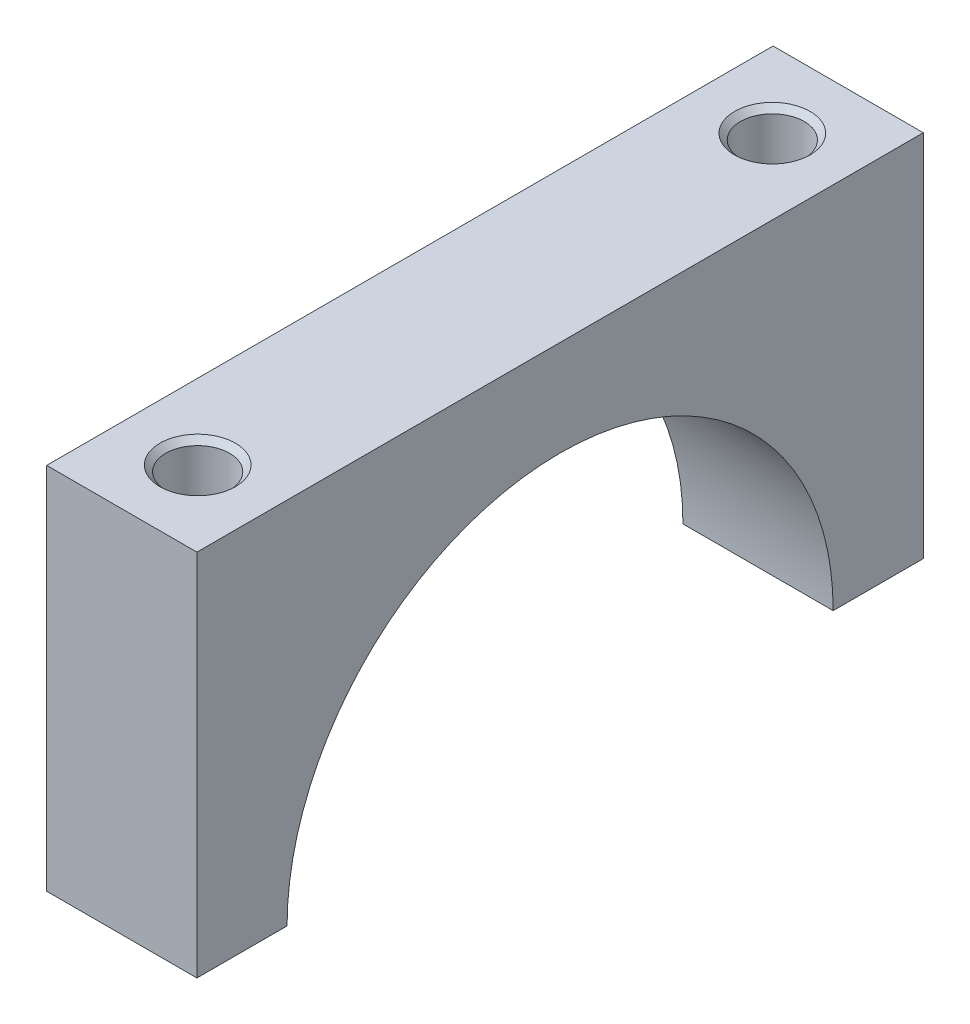
ISO-10303-21;
HEADER;
FILE_DESCRIPTION(('STEP AP214'),'2;1');
FILE_NAME('part.step','',(''),(''),'','','');
FILE_SCHEMA(('AUTOMOTIVE_DESIGN { 1 0 10303 214 1 1 1 1 }'));
ENDSEC;
DATA;
#1=APPLICATION_CONTEXT('core data for automotive mechanical design processes');
#2=APPLICATION_PROTOCOL_DEFINITION('international standard','automotive_design',2000,#1);
#3=PRODUCT_CONTEXT('',#1,'mechanical');
#4=PRODUCT('Part','Part','',(#3));
#5=PRODUCT_RELATED_PRODUCT_CATEGORY('part','',(#4));
#6=PRODUCT_DEFINITION_FORMATION('','',#4);
#7=PRODUCT_DEFINITION_CONTEXT('part definition',#1,'design');
#8=PRODUCT_DEFINITION('design','',#6,#7);
#9=PRODUCT_DEFINITION_SHAPE('','',#8);
#10=(LENGTH_UNIT() NAMED_UNIT(*) SI_UNIT(.MILLI.,.METRE.));
#11=(NAMED_UNIT(*) PLANE_ANGLE_UNIT() SI_UNIT($,.RADIAN.));
#12=(NAMED_UNIT(*) SI_UNIT($,.STERADIAN.) SOLID_ANGLE_UNIT());
#13=UNCERTAINTY_MEASURE_WITH_UNIT(LENGTH_MEASURE(1.E-05),#10,'distance_accuracy_value','');
#14=(GEOMETRIC_REPRESENTATION_CONTEXT(3) GLOBAL_UNCERTAINTY_ASSIGNED_CONTEXT((#13)) GLOBAL_UNIT_ASSIGNED_CONTEXT((#10,
#11,#12)) REPRESENTATION_CONTEXT('',''));
#15=CARTESIAN_POINT('',(0.,0.,0.));
#16=DIRECTION('',(0.,0.,1.));
#17=DIRECTION('',(1.,0.,0.));
#18=AXIS2_PLACEMENT_3D('',#15,#16,#17);
#19=CARTESIAN_POINT('',(20.,0.,48.35));
#20=DIRECTION('',(0.,0.,-1.));
#21=DIRECTION('',(0.,1.,0.));
#22=AXIS2_PLACEMENT_3D('',#19,#20,#21);
#23=PLANE('',#22);
#24=DIRECTION('',(0.,-1.,0.));
#25=VECTOR('',#24,1.);
#26=CARTESIAN_POINT('',(0.,0.,48.35));
#27=LINE('',#26,#25);
#28=CARTESIAN_POINT('',(0.,0.,48.35));
#29=VERTEX_POINT('',#28);
#30=CARTESIAN_POINT('',(0.,-49.098,48.35));
#31=VERTEX_POINT('',#30);
#32=EDGE_CURVE('E189',#29,#31,#27,.T.);
#33=ORIENTED_EDGE('',*,*,#32,.T.);
#34=DIRECTION('',(-1.,0.,0.));
#35=VECTOR('',#34,1.);
#36=CARTESIAN_POINT('',(20.,-49.098,48.35));
#37=LINE('',#36,#35);
#38=CARTESIAN_POINT('',(20.,-49.098,48.35));
#39=VERTEX_POINT('',#38);
#40=EDGE_CURVE('E240',#39,#31,#37,.T.);
#41=ORIENTED_EDGE('',*,*,#40,.F.);
#42=DIRECTION('',(0.,-1.,0.));
#43=VECTOR('',#42,1.);
#44=CARTESIAN_POINT('',(20.,0.,48.35));
#45=LINE('',#44,#43);
#46=CARTESIAN_POINT('',(20.,0.,48.35));
#47=VERTEX_POINT('',#46);
#48=EDGE_CURVE('E190',#47,#39,#45,.T.);
#49=ORIENTED_EDGE('',*,*,#48,.F.);
#50=DIRECTION('',(-1.,0.,0.));
#51=VECTOR('',#50,1.);
#52=CARTESIAN_POINT('',(20.,0.,48.35));
#53=LINE('',#52,#51);
#54=EDGE_CURVE('E209',#47,#29,#53,.T.);
#55=ORIENTED_EDGE('',*,*,#54,.T.);
#56=EDGE_LOOP('',(#33,#41,#49,#55));
#57=FACE_BOUND('',#56,.T.);
#58=ADVANCED_FACE('F42',(#57),#23,.F.);
#59=CARTESIAN_POINT('',(20.,-49.098,48.35));
#60=DIRECTION('',(0.,1.,0.));
#61=DIRECTION('',(0.,0.,1.));
#62=AXIS2_PLACEMENT_3D('',#59,#60,#61);
#63=PLANE('',#62);
#64=CARTESIAN_POINT('',(10.,-49.098,42.35));
#65=DIRECTION('',(0.,-1.,0.));
#66=DIRECTION('',(0.,0.,-1.));
#67=AXIS2_PLACEMENT_3D('',#64,#65,#66);
#68=CIRCLE('',#67,4.025);
#69=CARTESIAN_POINT('',(10.,-49.098,38.325));
#70=VERTEX_POINT('',#69);
#71=EDGE_CURVE('E172',#70,#70,#68,.T.);
#72=ORIENTED_EDGE('',*,*,#71,.F.);
#73=EDGE_LOOP('',(#72));
#74=FACE_BOUND('',#73,.T.);
#75=DIRECTION('',(0.,0.,-1.));
#76=VECTOR('',#75,1.);
#77=CARTESIAN_POINT('',(0.,-49.098,48.35));
#78=LINE('',#77,#76);
#79=CARTESIAN_POINT('',(0.,-49.098,36.35));
#80=VERTEX_POINT('',#79);
#81=EDGE_CURVE('E213',#31,#80,#78,.T.);
#82=ORIENTED_EDGE('',*,*,#81,.T.);
#83=DIRECTION('',(-1.,0.,0.));
#84=VECTOR('',#83,1.);
#85=CARTESIAN_POINT('',(20.,-49.098,36.35));
#86=LINE('',#85,#84);
#87=CARTESIAN_POINT('',(20.,-49.098,36.35));
#88=VERTEX_POINT('',#87);
#89=EDGE_CURVE('E237',#88,#80,#86,.T.);
#90=ORIENTED_EDGE('',*,*,#89,.F.);
#91=DIRECTION('',(0.,0.,-1.));
#92=VECTOR('',#91,1.);
#93=CARTESIAN_POINT('',(20.,-49.098,48.35));
#94=LINE('',#93,#92);
#95=EDGE_CURVE('E194',#39,#88,#94,.T.);
#96=ORIENTED_EDGE('',*,*,#95,.F.);
#97=ORIENTED_EDGE('',*,*,#40,.T.);
#98=EDGE_LOOP('',(#82,#90,#96,#97));
#99=FACE_BOUND('',#98,.T.);
#100=ADVANCED_FACE('F300',(#74,#99),#63,.F.);
#101=CARTESIAN_POINT('',(20.,-49.098,0.));
#102=DIRECTION('',(-1.,0.,0.));
#103=DIRECTION('',(0.,0.,1.));
#104=AXIS2_PLACEMENT_3D('',#101,#102,#103);
#105=CYLINDRICAL_SURFACE('',#104,36.35);
#106=CARTESIAN_POINT('',(0.,-49.098,0.));
#107=DIRECTION('',(-1.,0.,0.));
#108=DIRECTION('',(0.,0.,-1.));
#109=AXIS2_PLACEMENT_3D('',#106,#107,#108);
#110=CIRCLE('',#109,36.35);
#111=CARTESIAN_POINT('',(0.,-49.098,-36.35));
#112=VERTEX_POINT('',#111);
#113=EDGE_CURVE('E215',#80,#112,#110,.T.);
#114=ORIENTED_EDGE('',*,*,#113,.T.);
#115=DIRECTION('',(-1.,0.,0.));
#116=VECTOR('',#115,1.);
#117=CARTESIAN_POINT('',(20.,-49.098,-36.35));
#118=LINE('',#117,#116);
#119=CARTESIAN_POINT('',(20.,-49.098,-36.35));
#120=VERTEX_POINT('',#119);
#121=EDGE_CURVE('E234',#120,#112,#118,.T.);
#122=ORIENTED_EDGE('',*,*,#121,.F.);
#123=CARTESIAN_POINT('',(20.,-49.098,0.));
#124=DIRECTION('',(-1.,0.,0.));
#125=DIRECTION('',(0.,0.,-1.));
#126=AXIS2_PLACEMENT_3D('',#123,#124,#125);
#127=CIRCLE('',#126,36.35);
#128=EDGE_CURVE('E198',#88,#120,#127,.T.);
#129=ORIENTED_EDGE('',*,*,#128,.F.);
#130=ORIENTED_EDGE('',*,*,#89,.T.);
#131=EDGE_LOOP('',(#114,#122,#129,#130));
#132=FACE_BOUND('',#131,.T.);
#133=ADVANCED_FACE('F305',(#132),#105,.F.);
#134=CARTESIAN_POINT('',(20.,-49.098,-48.35));
#135=DIRECTION('',(0.,1.,0.));
#136=DIRECTION('',(0.,0.,1.));
#137=AXIS2_PLACEMENT_3D('',#134,#135,#136);
#138=PLANE('',#137);
#139=CARTESIAN_POINT('',(10.,-49.0980000000001,-42.35));
#140=DIRECTION('',(0.,-1.,0.));
#141=DIRECTION('',(0.,0.,-1.));
#142=AXIS2_PLACEMENT_3D('',#139,#140,#141);
#143=CIRCLE('',#142,4.025);
#144=CARTESIAN_POINT('',(10.,-49.0980000000001,-46.375));
#145=VERTEX_POINT('',#144);
#146=EDGE_CURVE('E179',#145,#145,#143,.T.);
#147=ORIENTED_EDGE('',*,*,#146,.F.);
#148=EDGE_LOOP('',(#147));
#149=FACE_BOUND('',#148,.T.);
#150=DIRECTION('',(0.,0.,-1.));
#151=VECTOR('',#150,1.);
#152=CARTESIAN_POINT('',(0.,-49.098,-48.35));
#153=LINE('',#152,#151);
#154=CARTESIAN_POINT('',(0.,-49.098,-48.35));
#155=VERTEX_POINT('',#154);
#156=EDGE_CURVE('E218',#112,#155,#153,.T.);
#157=ORIENTED_EDGE('',*,*,#156,.T.);
#158=DIRECTION('',(-1.,0.,0.));
#159=VECTOR('',#158,1.);
#160=CARTESIAN_POINT('',(20.,-49.098,-48.35));
#161=LINE('',#160,#159);
#162=CARTESIAN_POINT('',(20.,-49.098,-48.35));
#163=VERTEX_POINT('',#162);
#164=EDGE_CURVE('E231',#163,#155,#161,.T.);
#165=ORIENTED_EDGE('',*,*,#164,.F.);
#166=DIRECTION('',(0.,0.,-1.));
#167=VECTOR('',#166,1.);
#168=CARTESIAN_POINT('',(20.,-49.098,-48.35));
#169=LINE('',#168,#167);
#170=EDGE_CURVE('E201',#120,#163,#169,.T.);
#171=ORIENTED_EDGE('',*,*,#170,.F.);
#172=ORIENTED_EDGE('',*,*,#121,.T.);
#173=EDGE_LOOP('',(#157,#165,#171,#172));
#174=FACE_BOUND('',#173,.T.);
#175=ADVANCED_FACE('F331',(#149,#174),#138,.F.);
#176=CARTESIAN_POINT('',(20.,0.,-48.35));
#177=DIRECTION('',(0.,0.,1.));
#178=DIRECTION('',(0.,-1.,0.));
#179=AXIS2_PLACEMENT_3D('',#176,#177,#178);
#180=PLANE('',#179);
#181=DIRECTION('',(0.,1.,0.));
#182=VECTOR('',#181,1.);
#183=CARTESIAN_POINT('',(0.,0.,-48.35));
#184=LINE('',#183,#182);
#185=CARTESIAN_POINT('',(0.,0.,-48.35));
#186=VERTEX_POINT('',#185);
#187=EDGE_CURVE('E220',#155,#186,#184,.T.);
#188=ORIENTED_EDGE('',*,*,#187,.T.);
#189=DIRECTION('',(-1.,0.,0.));
#190=VECTOR('',#189,1.);
#191=CARTESIAN_POINT('',(20.,0.,-48.35));
#192=LINE('',#191,#190);
#193=CARTESIAN_POINT('',(20.,0.,-48.35));
#194=VERTEX_POINT('',#193);
#195=EDGE_CURVE('E228',#194,#186,#192,.T.);
#196=ORIENTED_EDGE('',*,*,#195,.F.);
#197=DIRECTION('',(0.,1.,0.));
#198=VECTOR('',#197,1.);
#199=CARTESIAN_POINT('',(20.,0.,-48.35));
#200=LINE('',#199,#198);
#201=EDGE_CURVE('E203',#163,#194,#200,.T.);
#202=ORIENTED_EDGE('',*,*,#201,.F.);
#203=ORIENTED_EDGE('',*,*,#164,.T.);
#204=EDGE_LOOP('',(#188,#196,#202,#203));
#205=FACE_BOUND('',#204,.T.);
#206=ADVANCED_FACE('F328',(#205),#180,.F.);
#207=CARTESIAN_POINT('',(20.,0.,48.35));
#208=DIRECTION('',(0.,-1.,0.));
#209=DIRECTION('',(0.,0.,-1.));
#210=AXIS2_PLACEMENT_3D('',#207,#208,#209);
#211=PLANE('',#210);
#212=CARTESIAN_POINT('',(10.,0.,38.25));
#213=DIRECTION('',(0.,1.,0.));
#214=DIRECTION('',(0.,0.,1.));
#215=AXIS2_PLACEMENT_3D('',#212,#213,#214);
#216=CIRCLE('',#215,5.025);
#217=CARTESIAN_POINT('',(10.,0.,43.275));
#218=VERTEX_POINT('',#217);
#219=EDGE_CURVE('E493',#218,#218,#216,.T.);
#220=ORIENTED_EDGE('',*,*,#219,.F.);
#221=EDGE_LOOP('',(#220));
#222=FACE_BOUND('',#221,.T.);
#223=CARTESIAN_POINT('',(10.,0.,-38.25));
#224=DIRECTION('',(0.,1.,0.));
#225=DIRECTION('',(0.,0.,1.));
#226=AXIS2_PLACEMENT_3D('',#223,#224,#225);
#227=CIRCLE('',#226,5.025);
#228=CARTESIAN_POINT('',(10.,0.,-33.225));
#229=VERTEX_POINT('',#228);
#230=EDGE_CURVE('E154',#229,#229,#227,.T.);
#231=ORIENTED_EDGE('',*,*,#230,.F.);
#232=EDGE_LOOP('',(#231));
#233=FACE_BOUND('',#232,.T.);
#234=DIRECTION('',(0.,0.,1.));
#235=VECTOR('',#234,1.);
#236=CARTESIAN_POINT('',(0.,0.,48.35));
#237=LINE('',#236,#235);
#238=EDGE_CURVE('E195',#186,#29,#237,.T.);
#239=ORIENTED_EDGE('',*,*,#238,.T.);
#240=ORIENTED_EDGE('',*,*,#54,.F.);
#241=DIRECTION('',(0.,0.,1.));
#242=VECTOR('',#241,1.);
#243=CARTESIAN_POINT('',(20.,0.,48.35));
#244=LINE('',#243,#242);
#245=EDGE_CURVE('E206',#194,#47,#244,.T.);
#246=ORIENTED_EDGE('',*,*,#245,.F.);
#247=ORIENTED_EDGE('',*,*,#195,.T.);
#248=EDGE_LOOP('',(#239,#240,#246,#247));
#249=FACE_BOUND('',#248,.T.);
#250=ADVANCED_FACE('F326',(#222,#233,#249),#211,.F.);
#251=CARTESIAN_POINT('',(20.,-49.098,0.));
#252=DIRECTION('',(1.,0.,0.));
#253=DIRECTION('',(0.,0.,-1.));
#254=AXIS2_PLACEMENT_3D('',#251,#252,#253);
#255=PLANE('',#254);
#256=ORIENTED_EDGE('',*,*,#48,.T.);
#257=ORIENTED_EDGE('',*,*,#95,.T.);
#258=ORIENTED_EDGE('',*,*,#128,.T.);
#259=ORIENTED_EDGE('',*,*,#170,.T.);
#260=ORIENTED_EDGE('',*,*,#201,.T.);
#261=ORIENTED_EDGE('',*,*,#245,.T.);
#262=EDGE_LOOP('',(#256,#257,#258,#259,#260,#261));
#263=FACE_BOUND('',#262,.T.);
#264=ADVANCED_FACE('F321',(#263),#255,.T.);
#265=CARTESIAN_POINT('',(0.,-49.098,0.));
#266=DIRECTION('',(1.,0.,0.));
#267=DIRECTION('',(0.,0.,-1.));
#268=AXIS2_PLACEMENT_3D('',#265,#266,#267);
#269=PLANE('',#268);
#270=ORIENTED_EDGE('',*,*,#32,.F.);
#271=ORIENTED_EDGE('',*,*,#238,.F.);
#272=ORIENTED_EDGE('',*,*,#187,.F.);
#273=ORIENTED_EDGE('',*,*,#156,.F.);
#274=ORIENTED_EDGE('',*,*,#113,.F.);
#275=ORIENTED_EDGE('',*,*,#81,.F.);
#276=EDGE_LOOP('',(#270,#271,#272,#273,#274,#275));
#277=FACE_BOUND('',#276,.T.);
#278=ADVANCED_FACE('F313',(#277),#269,.F.);
#279=CARTESIAN_POINT('',(10.,-19.0980000000001,-42.35));
#280=DIRECTION('',(0.,-1.,0.));
#281=DIRECTION('',(0.,0.,-1.));
#282=AXIS2_PLACEMENT_3D('',#279,#280,#281);
#283=CONICAL_SURFACE('',#282,3.39999999999999,1.02974425867665);
#284=CARTESIAN_POINT('',(10.,-19.0980000000001,-42.35));
#285=DIRECTION('',(0.,-1.,0.));
#286=DIRECTION('',(0.,0.,-1.));
#287=AXIS2_PLACEMENT_3D('',#284,#285,#286);
#288=CIRCLE('',#287,3.39999999999999);
#289=CARTESIAN_POINT('',(6.84089880799701,-19.0980000000001,-41.092987804878));
#290=VERTEX_POINT('',#289);
#291=CARTESIAN_POINT('',(13.159101192003,-19.0980000000001,-41.092987804878));
#292=VERTEX_POINT('',#291);
#293=EDGE_CURVE('E185',#290,#292,#288,.T.);
#294=ORIENTED_EDGE('',*,*,#293,.T.);
#295=CARTESIAN_POINT('',(13.1593495887329,-19.0982000000001,-41.0927117645257));
#296=CARTESIAN_POINT('',(13.0679155631725,-19.0245724107523,-41.1943534031814));
#297=CARTESIAN_POINT('',(12.9717848525151,-18.950338667675,-41.2913074377275));
#298=CARTESIAN_POINT('',(12.7711203623697,-18.8008151176566,-41.4751939539535));
#299=CARTESIAN_POINT('',(12.6665864772685,-18.7255252974523,-41.562126309645));
#300=CARTESIAN_POINT('',(12.4507258986973,-18.5744798603,-41.7248549438124));
#301=CARTESIAN_POINT('',(12.3394413683247,-18.4987293524859,-41.8007119342022));
#302=CARTESIAN_POINT('',(12.1105809107876,-18.3465135821424,-41.9413389987769));
#303=CARTESIAN_POINT('',(11.9930060561287,-18.2700484432813,-42.006110955112));
#304=CARTESIAN_POINT('',(11.7515562778314,-18.1159099482136,-42.1246330500636));
#305=CARTESIAN_POINT('',(11.6276373531427,-18.0382318289679,-42.1782877727051));
#306=CARTESIAN_POINT('',(11.4385049940666,-17.9214411057096,-42.2497192148978));
#307=CARTESIAN_POINT('',(11.3748925608123,-17.8824496896513,-42.2720283354697));
#308=CARTESIAN_POINT('',(11.2467070354241,-17.8044126635636,-42.3135894862173));
#309=CARTESIAN_POINT('',(11.1821339803102,-17.7653670556749,-42.3328416338696));
#310=CARTESIAN_POINT('',(11.0517616551762,-17.687040838781,-42.3683601355479));
#311=CARTESIAN_POINT('',(10.9859573744587,-17.6477602142158,-42.3846080371451));
#312=CARTESIAN_POINT('',(10.8535876569005,-17.5692830397819,-42.4139505180005));
#313=CARTESIAN_POINT('',(10.7870221148752,-17.5300865024424,-42.4270446558467));
#314=CARTESIAN_POINT('',(10.6532976161383,-17.4520089104156,-42.4500359257695));
#315=CARTESIAN_POINT('',(10.5861397667632,-17.4131274542667,-42.4599380904261));
#316=CARTESIAN_POINT('',(10.4847772605844,-17.3554214557581,-42.4723984027175));
#317=CARTESIAN_POINT('',(10.4508896158393,-17.3362911023218,-42.4761527075504));
#318=CARTESIAN_POINT('',(10.38282032239,-17.2984189580638,-42.4828618770599));
#319=CARTESIAN_POINT('',(10.3486387068368,-17.2796771242209,-42.4858168306908));
#320=CARTESIAN_POINT('',(10.2945111906403,-17.2508890527815,-42.4898293100551));
#321=CARTESIAN_POINT('',(10.2747376704965,-17.2405561339603,-42.4911574772164));
#322=CARTESIAN_POINT('',(10.2348925721709,-17.2203532040771,-42.4935509458889));
#323=CARTESIAN_POINT('',(10.2148205486576,-17.2104840007296,-42.4946158015721));
#324=CARTESIAN_POINT('',(10.1744572425387,-17.1917250661074,-42.4964655677512));
#325=CARTESIAN_POINT('',(10.1541701941135,-17.1828264838116,-42.4972531855138));
#326=CARTESIAN_POINT('',(10.1129080510634,-17.1667853620933,-42.498549850071));
#327=CARTESIAN_POINT('',(10.0919353715679,-17.1596372827361,-42.4990597821141));
#328=CARTESIAN_POINT('',(10.0624635663061,-17.152358860305,-42.4995484851192));
#329=CARTESIAN_POINT('',(10.0543724926376,-17.1506362678513,-42.4996599498468));
#330=CARTESIAN_POINT('',(10.0380791442902,-17.1478464698345,-42.499837252618));
#331=CARTESIAN_POINT('',(10.0298769010713,-17.1467790826548,-42.4999031033062));
#332=CARTESIAN_POINT('',(10.0052802141221,-17.1447611295534,-42.5000279351817));
#333=CARTESIAN_POINT('',(9.98877197802529,-17.1449605426534,-42.5000163027378));
#334=CARTESIAN_POINT('',(9.9506939920024,-17.1489201173431,-42.4997699497901));
#335=CARTESIAN_POINT('',(9.9292610928981,-17.1538391116437,-42.4994625313869));
#336=CARTESIAN_POINT('',(9.89772955959831,-17.1634137091763,-42.498782702759));
#337=CARTESIAN_POINT('',(9.88724592100276,-17.1670066320875,-42.4985168084677));
#338=CARTESIAN_POINT('',(9.86647003656353,-17.174708289586,-42.497914452429));
#339=CARTESIAN_POINT('',(9.85617772782368,-17.1788168510964,-42.4975780143346));
#340=CARTESIAN_POINT('',(9.82301779899239,-17.1927126546194,-42.4963756217734));
#341=CARTESIAN_POINT('',(9.80045489796188,-17.2031988143923,-42.4953720874559));
#342=CARTESIAN_POINT('',(9.75573515304936,-17.2249769417289,-42.4930336956209));
#343=CARTESIAN_POINT('',(9.73357857180195,-17.2362694088906,-42.4916986313915));
#344=CARTESIAN_POINT('',(9.68948627607073,-17.259309305591,-42.4886991087522));
#345=CARTESIAN_POINT('',(9.66755091508993,-17.2710573512343,-42.4870341908144));
#346=CARTESIAN_POINT('',(9.6238468346988,-17.2948106031187,-42.4833780099801));
#347=CARTESIAN_POINT('',(9.60207812573106,-17.3068158252987,-42.4813867268056));
#348=CARTESIAN_POINT('',(9.53715738163986,-17.3429527379865,-42.4749453586625));
#349=CARTESIAN_POINT('',(9.49418197866179,-17.3673176237391,-42.4700134418403));
#350=CARTESIAN_POINT('',(9.40859172754617,-17.4163018261384,-42.458871090739));
#351=CARTESIAN_POINT('',(9.36597662261531,-17.4409209278026,-42.45266166419));
#352=CARTESIAN_POINT('',(9.25543068125111,-17.5051816333902,-42.434838246061));
#353=CARTESIAN_POINT('',(9.18772238955552,-17.544934187948,-42.4222225216055));
#354=CARTESIAN_POINT('',(9.05305808468431,-17.6245531034548,-42.3937348292742));
#355=CARTESIAN_POINT('',(8.9861021802341,-17.6644194798339,-42.3778623970041));
#356=CARTESIAN_POINT('',(8.7864053005225,-17.7840961417295,-42.3253695882502));
#357=CARTESIAN_POINT('',(8.65492094042966,-17.863933858825,-42.2838875545639));
#358=CARTESIAN_POINT('',(8.39610848031101,-18.0234199850064,-42.1881619093475));
#359=CARTESIAN_POINT('',(8.2687912539634,-18.1030674629333,-42.1338875385105));
#360=CARTESIAN_POINT('',(8.01979790565206,-18.2617464288757,-42.0130353462238));
#361=CARTESIAN_POINT('',(7.89811938410323,-18.3407781667877,-41.9464628196028));
#362=CARTESIAN_POINT('',(7.69308025367972,-18.4770633769669,-41.8208506544185));
#363=CARTESIAN_POINT('',(7.60815732568573,-18.5345019790476,-41.7645395497978));
#364=CARTESIAN_POINT('',(7.44236966343678,-18.6488890717995,-41.6457945171114));
#365=CARTESIAN_POINT('',(7.36150440526685,-18.7058376249537,-41.5833613825961));
#366=CARTESIAN_POINT('',(7.20444273928984,-18.8190478960999,-41.4527742977864));
#367=CARTESIAN_POINT('',(7.12823584288724,-18.8753109100729,-41.3846340848495));
#368=CARTESIAN_POINT('',(6.98068633448427,-18.9872300021014,-41.2427798960758));
#369=CARTESIAN_POINT('',(6.90934464899891,-19.0428859628657,-41.1690648641941));
#370=CARTESIAN_POINT('',(6.84065041126706,-19.0982000000001,-41.0927117645257));
#371=B_SPLINE_CURVE_WITH_KNOTS('',3,(#295,#296,#297,#298,#299,#300,#301,#302,#303,#304,#305,
#306,#307,#308,#309,#310,#311,#312,#313,#314,#315,#316,#317,#318,#319,#320,#321,#322,#323,#324,
#325,#326,#327,#328,#329,#330,#331,#332,#333,#334,#335,#336,#337,#338,#339,#340,#341,#342,#343,
#344,#345,#346,#347,#348,#349,#350,#351,#352,#353,#354,#355,#356,#357,#358,#359,#360,#361,#362,
#363,#364,#365,#366,#367,#368,#369,#370),.UNSPECIFIED.,.F.,.F.,(4,2,2,2,2,2,2,2,2,2,2,2,2,2,2,2,
2,2,2,2,2,2,2,2,2,2,2,2,2,2,2,2,2,2,2,2,2,4),(0.,0.465679806597635,0.931365466887221,
1.39439393220006,1.85734370081792,2.32411577002812,2.55768793526316,2.7912511223706,
3.02620440147462,3.26119054639714,3.49580437074672,3.61308285177298,3.73034827631575,
3.79739491265617,3.86455430397726,3.93103838735222,3.99730926309076,4.02210511660204,
4.04689409383184,4.09609244326508,4.16160519050282,4.19486338353146,4.22811044297745,
4.30276955771466,4.37747534045772,4.45228593903814,4.52710118757567,4.67602007456875,
4.82482193813688,5.06330962474963,5.30183134246499,5.77917474088364,6.25767784129119,
6.73597540584637,7.08667126469461,7.43732172554242,7.78715115173717,8.13704701334583),.UNSPECIFIED.);
#372=EDGE_CURVE('E244',#292,#290,#371,.T.);
#373=ORIENTED_EDGE('',*,*,#372,.T.);
#374=EDGE_LOOP('',(#294,#373));
#375=FACE_BOUND('',#374,.T.);
#376=ADVANCED_FACE('F258',(#375),#283,.F.);
#377=CARTESIAN_POINT('',(10.,-49.0980000000001,-42.35));
#378=DIRECTION('',(0.,-1.,0.));
#379=DIRECTION('',(0.,0.,-1.));
#380=AXIS2_PLACEMENT_3D('',#377,#378,#379);
#381=CYLINDRICAL_SURFACE('',#380,3.39999999999999);
#382=ORIENTED_EDGE('',*,*,#293,.F.);
#383=DIRECTION('',(0.,1.,0.));
#384=VECTOR('',#383,1.);
#385=CARTESIAN_POINT('',(6.84089880799701,-14.1375,-41.092987804878));
#386=LINE('',#385,#384);
#387=CARTESIAN_POINT('',(6.84089880799701,-27.5,-41.092987804878));
#388=VERTEX_POINT('',#387);
#389=EDGE_CURVE('E73',#290,#388,#386,.F.);
#390=ORIENTED_EDGE('',*,*,#389,.T.);
#391=CARTESIAN_POINT('',(6.84076153496,-27.4998,-41.0933328519406));
#392=CARTESIAN_POINT('',(6.88135409166392,-27.5589576994373,-40.9912541521351));
#393=CARTESIAN_POINT('',(6.92676481575065,-27.6188252529889,-40.8915239826513));
#394=CARTESIAN_POINT('',(7.02659551988137,-27.7397879913482,-40.6975036961455));
#395=CARTESIAN_POINT('',(7.08101312263156,-27.8008828484901,-40.6032121524737));
#396=CARTESIAN_POINT('',(7.19825944980433,-27.9241467386056,-40.4207468111376));
#397=CARTESIAN_POINT('',(7.26108916392952,-27.9863158972224,-40.3325737351801));
#398=CARTESIAN_POINT('',(7.39450694625503,-28.1115377704178,-40.1629825367101));
#399=CARTESIAN_POINT('',(7.4650952419685,-28.1745905108594,-40.081564612409));
#400=CARTESIAN_POINT('',(7.61375248574621,-28.3017028706406,-39.9256472360671));
#401=CARTESIAN_POINT('',(7.69185835357408,-28.3657660171067,-39.8511858800109));
#402=CARTESIAN_POINT('',(7.85457181784196,-28.4943351933,-39.710164902309));
#403=CARTESIAN_POINT('',(7.93917956882025,-28.5588412335209,-39.6436054685737));
#404=CARTESIAN_POINT('',(8.11412921643948,-28.6878845055396,-39.5189196130696));
#405=CARTESIAN_POINT('',(8.20446310466781,-28.7524215737486,-39.460781771529));
#406=CARTESIAN_POINT('',(8.39037832426302,-28.8811467558052,-39.3532267985857));
#407=CARTESIAN_POINT('',(8.48595768585391,-28.9453349908289,-39.303806422591));
#408=CARTESIAN_POINT('',(8.63727449706822,-29.0435457189571,-39.2344874446539));
#409=CARTESIAN_POINT('',(8.69130886433028,-29.0779787814763,-39.2114020733762));
#410=CARTESIAN_POINT('',(8.80080531993012,-29.1462849589386,-39.1679564452674));
#411=CARTESIAN_POINT('',(8.85626723129814,-29.1801581424419,-39.1475958525725));
#412=CARTESIAN_POINT('',(8.96868962047146,-29.2470347124595,-39.1096417503311));
#413=CARTESIAN_POINT('',(9.025650925194,-29.280037598033,-39.0920498066683));
#414=CARTESIAN_POINT('',(9.14116569103501,-29.3446153332622,-39.0597108355539));
#415=CARTESIAN_POINT('',(9.19971878977121,-29.3761905036588,-39.0449631666713));
#416=CARTESIAN_POINT('',(9.29578610242644,-29.4252435974219,-39.0235175518015));
#417=CARTESIAN_POINT('',(9.33271648385968,-29.4434667045767,-39.0159070917738));
#418=CARTESIAN_POINT('',(9.40738992046399,-29.4786365832909,-39.0018277138462));
#419=CARTESIAN_POINT('',(9.44513280649681,-29.4955836172477,-38.9953585608912));
#420=CARTESIAN_POINT('',(9.52152491273234,-29.5276556183622,-38.9836144538241));
#421=CARTESIAN_POINT('',(9.56017291845851,-29.5427828767486,-38.9783379905093));
#422=CARTESIAN_POINT('',(9.63850593789096,-29.5704715795314,-38.969041449868));
#423=CARTESIAN_POINT('',(9.67819042538213,-29.5830342984266,-38.9650207479368));
#424=CARTESIAN_POINT('',(9.77423333215964,-29.6086955914591,-38.9570450395418));
#425=CARTESIAN_POINT('',(9.83113269489739,-29.6201408055219,-38.9537104484771));
#426=CARTESIAN_POINT('',(9.91725846103806,-29.6299396173171,-38.9508854689674));
#427=CARTESIAN_POINT('',(9.94604334889613,-29.6319806659175,-38.9503057143512));
#428=CARTESIAN_POINT('',(10.0036908675776,-29.6334761431034,-38.9498800711956));
#429=CARTESIAN_POINT('',(10.0325534968414,-29.6329306232002,-38.9500341680415));
#430=CARTESIAN_POINT('',(10.0900353931484,-29.6292995392382,-38.9510709243468));
#431=CARTESIAN_POINT('',(10.1186550591922,-29.6262196385036,-38.9519519594027));
#432=CARTESIAN_POINT('',(10.1755269597312,-29.6177758689911,-38.9544144811435));
#433=CARTESIAN_POINT('',(10.2037790648994,-29.6124112175818,-38.9559962078547));
#434=CARTESIAN_POINT('',(10.2599467456499,-29.599719103637,-38.9598341008132));
#435=CARTESIAN_POINT('',(10.2878596427995,-29.5923810878002,-38.9620939010633));
#436=CARTESIAN_POINT('',(10.3431563336696,-29.5761295379154,-38.9672474280305));
#437=CARTESIAN_POINT('',(10.3705401132844,-29.5672159619289,-38.9701411716226));
#438=CARTESIAN_POINT('',(10.437396484233,-29.5437195140346,-38.9780146467707));
#439=CARTESIAN_POINT('',(10.4765774089223,-29.5284261735137,-38.9833390285521));
#440=CARTESIAN_POINT('',(10.5539807218922,-29.4959810464792,-38.9952065201667));
#441=CARTESIAN_POINT('',(10.592202589191,-29.4788282756904,-39.0017502767972));
#442=CARTESIAN_POINT('',(10.6678700694824,-29.4431906794986,-39.0160182921615));
#443=CARTESIAN_POINT('',(10.7053143000964,-29.4247037064383,-39.0237444776971));
#444=CARTESIAN_POINT('',(10.7794714160066,-29.386793217811,-39.040337245416));
#445=CARTESIAN_POINT('',(10.816184177545,-29.3673695456333,-39.0492040187153));
#446=CARTESIAN_POINT('',(10.9256316970475,-29.3079420401903,-39.0775534843104));
#447=CARTESIAN_POINT('',(10.9973841544226,-29.2669241878833,-39.0987297326225));
#448=CARTESIAN_POINT('',(11.1385052752307,-29.1834871116485,-39.1454220377693));
#449=CARTESIAN_POINT('',(11.2078759780313,-29.1410691508606,-39.1709342646136));
#450=CARTESIAN_POINT('',(11.3797139362043,-29.0332710198017,-39.2405181712131));
#451=CARTESIAN_POINT('',(11.4807411542233,-28.9673620719907,-39.2873641424166));
#452=CARTESIAN_POINT('',(11.6774442609479,-28.8348620385926,-39.390521203601));
#453=CARTESIAN_POINT('',(11.7731170419359,-28.7682705828669,-39.4468377158911));
#454=CARTESIAN_POINT('',(11.9582262459104,-28.6352321223634,-39.5683511717958));
#455=CARTESIAN_POINT('',(12.0476797321826,-28.5687852495577,-39.633522240769));
#456=CARTESIAN_POINT('',(12.2199583948425,-28.4362547932863,-39.7723994808297));
#457=CARTESIAN_POINT('',(12.3027844484855,-28.3701711628213,-39.8461045191279));
#458=CARTESIAN_POINT('',(12.4649606785304,-28.2354372356178,-40.0053250355944));
#459=CARTESIAN_POINT('',(12.5439449157929,-28.1668187479647,-40.0912409673994));
#460=CARTESIAN_POINT('',(12.6930009711119,-28.030556952219,-40.2712023725719));
#461=CARTESIAN_POINT('',(12.7630724929507,-27.9629136766042,-40.3652481159625));
#462=CARTESIAN_POINT('',(12.8938084639157,-27.8284929118946,-40.5611994309869));
#463=CARTESIAN_POINT('',(12.9544218779604,-27.7617217886055,-40.6631434824551));
#464=CARTESIAN_POINT('',(13.0650145026258,-27.6296187782916,-40.8735693533165));
#465=CARTESIAN_POINT('',(13.1149906952373,-27.5642873044271,-40.9820530169656));
#466=CARTESIAN_POINT('',(13.15923846504,-27.4998,-41.0933328519406));
#467=B_SPLINE_CURVE_WITH_KNOTS('',3,(#391,#392,#393,#394,#395,#396,#397,#398,#399,#400,#401,
#402,#403,#404,#405,#406,#407,#408,#409,#410,#411,#412,#413,#414,#415,#416,#417,#418,#419,#420,
#421,#422,#423,#424,#425,#426,#427,#428,#429,#430,#431,#432,#433,#434,#435,#436,#437,#438,#439,
#440,#441,#442,#443,#444,#445,#446,#447,#448,#449,#450,#451,#452,#453,#454,#455,#456,#457,#458,
#459,#460,#461,#462,#463,#464,#465,#466),.UNSPECIFIED.,.F.,.F.,(4,2,2,2,2,2,2,2,2,2,2,2,2,2,2,2,
2,2,2,2,2,2,2,2,2,2,2,2,2,2,2,2,2,2,2,2,2,4),(0.,0.374167869112552,0.748237136628754,
1.1223504529184,1.49647474265949,1.87254054626076,2.24861529104827,2.62417520220284,
2.99959503575522,3.20385036738404,3.40808049869958,3.61242572592477,3.81672481589305,
3.94232825001678,4.06790578551662,4.19332351722468,4.31867876754729,4.49226223887467,
4.57873938546888,4.66521480988631,4.75149751951755,4.83780980872285,4.9245931944843,
5.01137889061528,5.13846736556473,5.26562344538591,5.39298898038879,5.52037588452393,
5.77613510653346,6.03166957830299,6.41937440958947,6.80730197977623,7.19411940428658,
7.58088554182783,7.98649476811496,8.39211747146854,8.79985835848331,9.20771477662527),.UNSPECIFIED.);
#468=CARTESIAN_POINT('',(13.159101192003,-27.5,-41.092987804878));
#469=VERTEX_POINT('',#468);
#470=EDGE_CURVE('E252',#388,#469,#467,.T.);
#471=ORIENTED_EDGE('',*,*,#470,.T.);
#472=DIRECTION('',(0.,1.,0.));
#473=VECTOR('',#472,1.);
#474=CARTESIAN_POINT('',(13.159101192003,-14.1375,-41.092987804878));
#475=LINE('',#474,#473);
#476=EDGE_CURVE('E166',#469,#292,#475,.T.);
#477=ORIENTED_EDGE('',*,*,#476,.T.);
#478=EDGE_LOOP('',(#382,#390,#471,#477));
#479=FACE_BOUND('',#478,.T.);
#480=CARTESIAN_POINT('',(10.,-48.4730000000001,-42.35));
#481=DIRECTION('',(0.,-1.,0.));
#482=DIRECTION('',(0.,0.,-1.));
#483=AXIS2_PLACEMENT_3D('',#480,#481,#482);
#484=CIRCLE('',#483,3.4);
#485=CARTESIAN_POINT('',(10.,-48.4730000000001,-45.75));
#486=VERTEX_POINT('',#485);
#487=EDGE_CURVE('E182',#486,#486,#484,.T.);
#488=ORIENTED_EDGE('',*,*,#487,.T.);
#489=EDGE_LOOP('',(#488));
#490=FACE_BOUND('',#489,.T.);
#491=ADVANCED_FACE('F363',(#479,#490),#381,.F.);
#492=CARTESIAN_POINT('',(10.,-49.0980000000001,-42.35));
#493=DIRECTION('',(0.,-1.,0.));
#494=DIRECTION('',(0.,0.,-1.));
#495=AXIS2_PLACEMENT_3D('',#492,#493,#494);
#496=CONICAL_SURFACE('',#495,4.025,0.785398163397452);
#497=ORIENTED_EDGE('',*,*,#487,.F.);
#498=EDGE_LOOP('',(#497));
#499=FACE_BOUND('',#498,.T.);
#500=ORIENTED_EDGE('',*,*,#146,.T.);
#501=EDGE_LOOP('',(#500));
#502=FACE_BOUND('',#501,.T.);
#503=ADVANCED_FACE('F281',(#499,#502),#496,.F.);
#504=CARTESIAN_POINT('',(10.,-19.098,42.35));
#505=DIRECTION('',(0.,-1.,0.));
#506=DIRECTION('',(0.,0.,-1.));
#507=AXIS2_PLACEMENT_3D('',#504,#505,#506);
#508=CONICAL_SURFACE('',#507,3.39999999999999,1.02974425867665);
#509=CARTESIAN_POINT('',(10.,-19.098,42.35));
#510=DIRECTION('',(0.,-1.,0.));
#511=DIRECTION('',(0.,0.,-1.));
#512=AXIS2_PLACEMENT_3D('',#509,#510,#511);
#513=CIRCLE('',#512,3.39999999999999);
#514=CARTESIAN_POINT('',(13.159101192003,-19.098,41.0929878048781));
#515=VERTEX_POINT('',#514);
#516=CARTESIAN_POINT('',(6.84089880799703,-19.098,41.0929878048781));
#517=VERTEX_POINT('',#516);
#518=EDGE_CURVE('E153',#515,#517,#513,.T.);
#519=ORIENTED_EDGE('',*,*,#518,.T.);
#520=CARTESIAN_POINT('',(6.84065041126741,-19.0981999999997,41.0927117645261));
#521=CARTESIAN_POINT('',(6.93208443682784,-19.0245724107519,41.1943534031817));
#522=CARTESIAN_POINT('',(7.02821514748524,-18.9503386676746,41.2913074377279));
#523=CARTESIAN_POINT('',(7.22887963763071,-18.8008151176562,41.4751939539538));
#524=CARTESIAN_POINT('',(7.33341352273191,-18.7255252974519,41.5621263096453));
#525=CARTESIAN_POINT('',(7.54927410130315,-18.5744798602996,41.7248549438127));
#526=CARTESIAN_POINT('',(7.66055863167575,-18.4987293524856,41.8007119342025));
#527=CARTESIAN_POINT('',(7.88941908921283,-18.346513582142,41.9413389987772));
#528=CARTESIAN_POINT('',(8.00699394387174,-18.2700484432809,42.0061109551122));
#529=CARTESIAN_POINT('',(8.24844372216911,-18.1159099482132,42.1246330500638));
#530=CARTESIAN_POINT('',(8.37236264685781,-18.0382318289675,42.1782877727053));
#531=CARTESIAN_POINT('',(8.5614950059339,-17.9214411057092,42.249719214898));
#532=CARTESIAN_POINT('',(8.62510743918823,-17.8824496896509,42.2720283354698));
#533=CARTESIAN_POINT('',(8.75329296457651,-17.8044126635632,42.3135894862175));
#534=CARTESIAN_POINT('',(8.81786601969034,-17.7653670556745,42.3328416338698));
#535=CARTESIAN_POINT('',(8.94823834482434,-17.6870408387805,42.368360135548));
#536=CARTESIAN_POINT('',(9.01404262554188,-17.6477602142154,42.3846080371452));
#537=CARTESIAN_POINT('',(9.14641234310005,-17.5692830397815,42.4139505180007));
#538=CARTESIAN_POINT('',(9.2129778851254,-17.530086502442,42.4270446558468));
#539=CARTESIAN_POINT('',(9.34670238386227,-17.4520089104152,42.4500359257696));
#540=CARTESIAN_POINT('',(9.41386023323735,-17.4131274542663,42.4599380904261));
#541=CARTESIAN_POINT('',(9.51522273941619,-17.3554214557577,42.4723984027176));
#542=CARTESIAN_POINT('',(9.54911038416122,-17.3362911023214,42.4761527075504));
#543=CARTESIAN_POINT('',(9.61717967761057,-17.2984189580633,42.4828618770599));
#544=CARTESIAN_POINT('',(9.65136129316374,-17.2796771242204,42.4858168306909));
#545=CARTESIAN_POINT('',(9.70548880936017,-17.2508890527812,42.4898293100551));
#546=CARTESIAN_POINT('',(9.72526232950397,-17.2405561339599,42.4911574772164));
#547=CARTESIAN_POINT('',(9.76510742782942,-17.2203532040768,42.4935509458889));
#548=CARTESIAN_POINT('',(9.78517945134266,-17.2104840007293,42.4946158015721));
#549=CARTESIAN_POINT('',(9.8255427574614,-17.1917250661072,42.4964655677512));
#550=CARTESIAN_POINT('',(9.84582980588648,-17.1828264838115,42.4972531855138));
#551=CARTESIAN_POINT('',(9.88709194893645,-17.1667853620932,42.498549850071));
#552=CARTESIAN_POINT('',(9.90806462843188,-17.1596372827361,42.4990597821141));
#553=CARTESIAN_POINT('',(9.9375364336936,-17.1523588603049,42.4995484851192));
#554=CARTESIAN_POINT('',(9.94562750736208,-17.1506362678512,42.4996599498468));
#555=CARTESIAN_POINT('',(9.96192085570948,-17.1478464698344,42.499837252618));
#556=CARTESIAN_POINT('',(9.97012309892836,-17.1467790826547,42.4999031033062));
#557=CARTESIAN_POINT('',(9.99471978587752,-17.1447611295533,42.5000279351817));
#558=CARTESIAN_POINT('',(10.0112280219743,-17.1449605426532,42.5000163027378));
#559=CARTESIAN_POINT('',(10.0493060079971,-17.1489201173429,42.49976994979));
#560=CARTESIAN_POINT('',(10.0707389071013,-17.1538391116434,42.4994625313869));
#561=CARTESIAN_POINT('',(10.102270440401,-17.1634137091759,42.498782702759));
#562=CARTESIAN_POINT('',(10.1127540789965,-17.1670066320871,42.4985168084677));
#563=CARTESIAN_POINT('',(10.1335299634356,-17.1747082895855,42.497914452429));
#564=CARTESIAN_POINT('',(10.1438222721755,-17.1788168510959,42.4975780143346));
#565=CARTESIAN_POINT('',(10.1769822010066,-17.1927126546188,42.4963756217734));
#566=CARTESIAN_POINT('',(10.199545102037,-17.2031988143916,42.495372087456));
#567=CARTESIAN_POINT('',(10.2442648469492,-17.2249769417281,42.4930336956209));
#568=CARTESIAN_POINT('',(10.2664214281965,-17.2362694088897,42.4916986313915));
#569=CARTESIAN_POINT('',(10.3105137239275,-17.2593093055899,42.4886991087523));
#570=CARTESIAN_POINT('',(10.3324490849082,-17.2710573512331,42.4870341908146));
#571=CARTESIAN_POINT('',(10.376153165299,-17.2948106031174,42.4833780099803));
#572=CARTESIAN_POINT('',(10.3979218742667,-17.3068158252973,42.4813867268058));
#573=CARTESIAN_POINT('',(10.4628426183575,-17.3429527379849,42.4749453586628));
#574=CARTESIAN_POINT('',(10.5058180213353,-17.3673176237373,42.4700134418406));
#575=CARTESIAN_POINT('',(10.5914082724505,-17.4163018261363,42.4588710907395));
#576=CARTESIAN_POINT('',(10.6340233773811,-17.4409209278004,42.4526616641906));
#577=CARTESIAN_POINT('',(10.7445693187451,-17.5051816333878,42.4348382460617));
#578=CARTESIAN_POINT('',(10.8122776104407,-17.5449341879457,42.4222225216063));
#579=CARTESIAN_POINT('',(10.9469419153119,-17.6245531034524,42.393734829275));
#580=CARTESIAN_POINT('',(11.0138978197621,-17.6644194798316,42.377862397005));
#581=CARTESIAN_POINT('',(11.2135946994738,-17.7840961417271,42.3253695882513));
#582=CARTESIAN_POINT('',(11.3450790595667,-17.8639338588227,42.2838875545651));
#583=CARTESIAN_POINT('',(11.6038915196854,-18.0234199850041,42.188161909349));
#584=CARTESIAN_POINT('',(11.731208746033,-18.103067462931,42.133887538512));
#585=CARTESIAN_POINT('',(11.9802020943445,-18.2617464288733,42.0130353462257));
#586=CARTESIAN_POINT('',(12.1018806158934,-18.3407781667854,41.9464628196047));
#587=CARTESIAN_POINT('',(12.3069197463172,-18.4770633769647,41.8208506544204));
#588=CARTESIAN_POINT('',(12.3918426743115,-18.5345019790456,41.7645395497997));
#589=CARTESIAN_POINT('',(12.557630336561,-18.6488890717979,41.6457945171131));
#590=CARTESIAN_POINT('',(12.6384955947312,-18.7058376249522,41.5833613825977));
#591=CARTESIAN_POINT('',(12.7955572607087,-18.8190478960987,41.4527742977877));
#592=CARTESIAN_POINT('',(12.8717641571115,-18.8753109100719,41.3846340848506));
#593=CARTESIAN_POINT('',(13.019313665515,-18.9872300021007,41.2427798960766));
#594=CARTESIAN_POINT('',(13.0906553510005,-19.0428859628652,41.1690648641947));
#595=CARTESIAN_POINT('',(13.1593495887326,-19.0981999999997,41.0927117645261));
#596=B_SPLINE_CURVE_WITH_KNOTS('',3,(#520,#521,#522,#523,#524,#525,#526,#527,#528,#529,#530,
#531,#532,#533,#534,#535,#536,#537,#538,#539,#540,#541,#542,#543,#544,#545,#546,#547,#548,#549,
#550,#551,#552,#553,#554,#555,#556,#557,#558,#559,#560,#561,#562,#563,#564,#565,#566,#567,#568,
#569,#570,#571,#572,#573,#574,#575,#576,#577,#578,#579,#580,#581,#582,#583,#584,#585,#586,#587,
#588,#589,#590,#591,#592,#593,#594,#595),.UNSPECIFIED.,.F.,.F.,(4,2,2,2,2,2,2,2,2,2,2,2,2,2,2,2,
2,2,2,2,2,2,2,2,2,2,2,2,2,2,2,2,2,2,2,2,2,4),(0.,0.465679806597615,0.931365466887183,
1.39439393220006,1.85734370081795,2.32411577002818,2.55768793526325,2.7912511223707,
3.02620440147471,3.26119054639722,3.49580437074679,3.61308285177305,3.73034827631581,
3.79739491265599,3.86455430397684,3.93103838735158,3.9973092630899,4.02210511660115,
4.04689409383092,4.09609244326409,4.16160519050156,4.19486338353006,4.22811044297592,
4.30276955771268,4.3774753404553,4.45228593903527,4.52710118757236,4.67602007456457,
4.82482193813184,5.06330962474458,5.30183134245994,5.77917474087861,6.25767784128615,
6.73597540584132,7.08667126469052,7.4373217255393,7.78715115173504,8.13704701334469),.UNSPECIFIED.);
#597=EDGE_CURVE('E55',#517,#515,#596,.T.);
#598=ORIENTED_EDGE('',*,*,#597,.T.);
#599=EDGE_LOOP('',(#519,#598));
#600=FACE_BOUND('',#599,.T.);
#601=ADVANCED_FACE('F277',(#600),#508,.F.);
#602=CARTESIAN_POINT('',(10.,-49.098,42.35));
#603=DIRECTION('',(0.,-1.,0.));
#604=DIRECTION('',(0.,0.,-1.));
#605=AXIS2_PLACEMENT_3D('',#602,#603,#604);
#606=CYLINDRICAL_SURFACE('',#605,3.39999999999999);
#607=ORIENTED_EDGE('',*,*,#518,.F.);
#608=DIRECTION('',(0.,1.,0.));
#609=VECTOR('',#608,1.);
#610=CARTESIAN_POINT('',(13.159101192003,-14.1375,41.0929878048781));
#611=LINE('',#610,#609);
#612=CARTESIAN_POINT('',(13.159101192003,-27.5,41.0929878048781));
#613=VERTEX_POINT('',#612);
#614=EDGE_CURVE('E62',#515,#613,#611,.F.);
#615=ORIENTED_EDGE('',*,*,#614,.T.);
#616=CARTESIAN_POINT('',(13.15923846504,-27.4998,41.0933328519406));
#617=CARTESIAN_POINT('',(13.1186459083361,-27.5589576994373,40.9912541521351));
#618=CARTESIAN_POINT('',(13.0732351842493,-27.6188252529889,40.8915239826514));
#619=CARTESIAN_POINT('',(12.9734044801186,-27.7397879913482,40.6975036961455));
#620=CARTESIAN_POINT('',(12.9189868773684,-27.8008828484901,40.6032121524737));
#621=CARTESIAN_POINT('',(12.8017405501956,-27.9241467386056,40.4207468111377));
#622=CARTESIAN_POINT('',(12.7389108360704,-27.9863158972224,40.3325737351802));
#623=CARTESIAN_POINT('',(12.6054930537449,-28.1115377704179,40.1629825367101));
#624=CARTESIAN_POINT('',(12.5349047580315,-28.1745905108594,40.081564612409));
#625=CARTESIAN_POINT('',(12.3862475142537,-28.3017028706407,39.9256472360671));
#626=CARTESIAN_POINT('',(12.3081416464259,-28.3657660171067,39.851185880011));
#627=CARTESIAN_POINT('',(12.145428182158,-28.4943351933,39.710164902309));
#628=CARTESIAN_POINT('',(12.0608204311797,-28.5588412335209,39.6436054685738));
#629=CARTESIAN_POINT('',(11.8858707835605,-28.6878845055397,39.5189196130697));
#630=CARTESIAN_POINT('',(11.7955368953321,-28.7524215737486,39.4607817715291));
#631=CARTESIAN_POINT('',(11.6096216757369,-28.8811467558052,39.3532267985857));
#632=CARTESIAN_POINT('',(11.514042314146,-28.9453349908289,39.3038064225911));
#633=CARTESIAN_POINT('',(11.3627255029317,-29.0435457189571,39.234487444654));
#634=CARTESIAN_POINT('',(11.3086911356697,-29.0779787814763,39.2114020733763));
#635=CARTESIAN_POINT('',(11.1991946800698,-29.1462849589386,39.1679564452674));
#636=CARTESIAN_POINT('',(11.1437327687018,-29.1801581424419,39.1475958525725));
#637=CARTESIAN_POINT('',(11.0313103795285,-29.2470347124595,39.1096417503312));
#638=CARTESIAN_POINT('',(10.974349074806,-29.280037598033,39.0920498066684));
#639=CARTESIAN_POINT('',(10.858834308965,-29.3446153332622,39.059710835554));
#640=CARTESIAN_POINT('',(10.8002812102288,-29.3761905036587,39.0449631666714));
#641=CARTESIAN_POINT('',(10.7042138975736,-29.4252435974219,39.0235175518016));
#642=CARTESIAN_POINT('',(10.6672835161403,-29.4434667045767,39.0159070917738));
#643=CARTESIAN_POINT('',(10.592610079536,-29.4786365832908,39.0018277138463));
#644=CARTESIAN_POINT('',(10.5548671935032,-29.4955836172477,38.9953585608913));
#645=CARTESIAN_POINT('',(10.4784750872676,-29.5276556183622,38.9836144538242));
#646=CARTESIAN_POINT('',(10.4398270815415,-29.5427828767486,38.9783379905094));
#647=CARTESIAN_POINT('',(10.361494062109,-29.5704715795314,38.9690414498681));
#648=CARTESIAN_POINT('',(10.3218095746178,-29.5830342984265,38.9650207479369));
#649=CARTESIAN_POINT('',(10.2257666678403,-29.6086955914591,38.9570450395419));
#650=CARTESIAN_POINT('',(10.1688673051025,-29.6201408055218,38.9537104484772));
#651=CARTESIAN_POINT('',(10.0827415389619,-29.6299396173171,38.9508854689675));
#652=CARTESIAN_POINT('',(10.0539566511038,-29.6319806659175,38.9503057143513));
#653=CARTESIAN_POINT('',(9.99630913242232,-29.6334761431034,38.9498800711956));
#654=CARTESIAN_POINT('',(9.96744650315855,-29.6329306232002,38.9500341680416));
#655=CARTESIAN_POINT('',(9.90996460685151,-29.6292995392382,38.9510709243469));
#656=CARTESIAN_POINT('',(9.88134494080775,-29.6262196385035,38.9519519594028));
#657=CARTESIAN_POINT('',(9.82447304026872,-29.617775868991,38.9544144811436));
#658=CARTESIAN_POINT('',(9.79622093510048,-29.6124112175817,38.9559962078548));
#659=CARTESIAN_POINT('',(9.74005325435004,-29.599719103637,38.9598341008133));
#660=CARTESIAN_POINT('',(9.71214035720037,-29.5923810878001,38.9620939010634));
#661=CARTESIAN_POINT('',(9.65684366633027,-29.5761295379153,38.9672474280306));
#662=CARTESIAN_POINT('',(9.62945988671555,-29.5672159619288,38.9701411716227));
#663=CARTESIAN_POINT('',(9.56260351576686,-29.5437195140345,38.9780146467708));
#664=CARTESIAN_POINT('',(9.52342259107757,-29.5284261735136,38.9833390285522));
#665=CARTESIAN_POINT('',(9.44601927810769,-29.4959810464791,38.9952065201668));
#666=CARTESIAN_POINT('',(9.40779741080885,-29.4788282756903,39.0017502767973));
#667=CARTESIAN_POINT('',(9.33212993051751,-29.4431906794985,39.0160182921616));
#668=CARTESIAN_POINT('',(9.29468569990342,-29.4247037064382,39.0237444776972));
#669=CARTESIAN_POINT('',(9.22052858399323,-29.3867932178109,39.0403372454161));
#670=CARTESIAN_POINT('',(9.1838158224548,-29.3673695456332,39.0492040187154));
#671=CARTESIAN_POINT('',(9.0743683029523,-29.3079420401902,39.0775534843105));
#672=CARTESIAN_POINT('',(9.0026158455772,-29.2669241878832,39.0987297326227));
#673=CARTESIAN_POINT('',(8.86149472476914,-29.1834871116484,39.1454220377694));
#674=CARTESIAN_POINT('',(8.79212402196851,-29.1410691508604,39.1709342646138));
#675=CARTESIAN_POINT('',(8.62028606379543,-29.0332710198015,39.2405181712133));
#676=CARTESIAN_POINT('',(8.51925884577647,-28.9673620719905,39.2873641424168));
#677=CARTESIAN_POINT('',(8.32255573905187,-28.8348620385925,39.3905212036012));
#678=CARTESIAN_POINT('',(8.22688295806388,-28.7682705828667,39.4468377158913));
#679=CARTESIAN_POINT('',(8.04177375408943,-28.6352321223632,39.568351171796));
#680=CARTESIAN_POINT('',(7.95232026781721,-28.5687852495575,39.6335222407692));
#681=CARTESIAN_POINT('',(7.7800416051573,-28.4362547932861,39.77239948083));
#682=CARTESIAN_POINT('',(7.69721555151431,-28.3701711628211,39.8461045191281));
#683=CARTESIAN_POINT('',(7.53503932146944,-28.2354372356177,40.0053250355946));
#684=CARTESIAN_POINT('',(7.45605508420697,-28.1668187479646,40.0912409673996));
#685=CARTESIAN_POINT('',(7.30699902888802,-28.0305569522189,40.2712023725721));
#686=CARTESIAN_POINT('',(7.23692750704924,-27.9629136766041,40.3652481159627));
#687=CARTESIAN_POINT('',(7.1061915360843,-27.8284929118945,40.561199430987));
#688=CARTESIAN_POINT('',(7.0455781220396,-27.7617217886055,40.6631434824552));
#689=CARTESIAN_POINT('',(6.93498549737425,-27.6296187782916,40.8735693533165));
#690=CARTESIAN_POINT('',(6.88500930476268,-27.564287304427,40.9820530169656));
#691=CARTESIAN_POINT('',(6.84076153496001,-27.4998,41.0933328519406));
#692=B_SPLINE_CURVE_WITH_KNOTS('',3,(#616,#617,#618,#619,#620,#621,#622,#623,#624,#625,#626,
#627,#628,#629,#630,#631,#632,#633,#634,#635,#636,#637,#638,#639,#640,#641,#642,#643,#644,#645,
#646,#647,#648,#649,#650,#651,#652,#653,#654,#655,#656,#657,#658,#659,#660,#661,#662,#663,#664,
#665,#666,#667,#668,#669,#670,#671,#672,#673,#674,#675,#676,#677,#678,#679,#680,#681,#682,#683,
#684,#685,#686,#687,#688,#689,#690,#691),.UNSPECIFIED.,.F.,.F.,(4,2,2,2,2,2,2,2,2,2,2,2,2,2,2,2,
2,2,2,2,2,2,2,2,2,2,2,2,2,2,2,2,2,2,2,2,2,4),(0.,0.374167869112552,0.748237136628765,
1.12235045291841,1.49647474265952,1.87254054626077,2.2486152910483,2.62417520220287,
2.99959503575525,3.20385036738405,3.40808049869955,3.61242572592472,3.81672481589297,
3.94232825001671,4.06790578551657,4.19332351722464,4.31867876754727,4.49226223887466,
4.57873938546888,4.66521480988631,4.75149751951756,4.83780980872286,4.92459319448432,
5.01137889061531,5.13846736556478,5.26562344538598,5.39298898038888,5.52037588452404,
5.77613510653361,6.03166957830318,6.41937440958967,6.80730197977644,7.19411940428678,
7.58088554182804,7.98649476811508,8.39211747146857,8.79985835848325,9.20771477662513),.UNSPECIFIED.);
#693=CARTESIAN_POINT('',(6.84089880799703,-27.5,41.0929878048781));
#694=VERTEX_POINT('',#693);
#695=EDGE_CURVE('E11',#613,#694,#692,.T.);
#696=ORIENTED_EDGE('',*,*,#695,.T.);
#697=DIRECTION('',(0.,1.,0.));
#698=VECTOR('',#697,1.);
#699=CARTESIAN_POINT('',(6.84089880799703,-14.1375,41.0929878048781));
#700=LINE('',#699,#698);
#701=EDGE_CURVE('E144',#694,#517,#700,.T.);
#702=ORIENTED_EDGE('',*,*,#701,.T.);
#703=EDGE_LOOP('',(#607,#615,#696,#702));
#704=FACE_BOUND('',#703,.T.);
#705=CARTESIAN_POINT('',(10.,-48.473,42.35));
#706=DIRECTION('',(0.,-1.,0.));
#707=DIRECTION('',(0.,0.,-1.));
#708=AXIS2_PLACEMENT_3D('',#705,#706,#707);
#709=CIRCLE('',#708,3.4);
#710=CARTESIAN_POINT('',(10.,-48.473,38.95));
#711=VERTEX_POINT('',#710);
#712=EDGE_CURVE('E175',#711,#711,#709,.T.);
#713=ORIENTED_EDGE('',*,*,#712,.T.);
#714=EDGE_LOOP('',(#713));
#715=FACE_BOUND('',#714,.T.);
#716=ADVANCED_FACE('F150',(#704,#715),#606,.F.);
#717=CARTESIAN_POINT('',(10.,-49.098,42.35));
#718=DIRECTION('',(0.,-1.,0.));
#719=DIRECTION('',(0.,0.,-1.));
#720=AXIS2_PLACEMENT_3D('',#717,#718,#719);
#721=CONICAL_SURFACE('',#720,4.025,0.785398163397452);
#722=ORIENTED_EDGE('',*,*,#712,.F.);
#723=EDGE_LOOP('',(#722));
#724=FACE_BOUND('',#723,.T.);
#725=ORIENTED_EDGE('',*,*,#71,.T.);
#726=EDGE_LOOP('',(#725));
#727=FACE_BOUND('',#726,.T.);
#728=ADVANCED_FACE('F270',(#724,#727),#721,.F.);
#729=CARTESIAN_POINT('',(10.,-27.5,-38.25));
#730=DIRECTION('',(0.,1.,0.));
#731=DIRECTION('',(0.,0.,1.));
#732=AXIS2_PLACEMENT_3D('',#729,#730,#731);
#733=CONICAL_SURFACE('',#732,4.24999999999999,1.02974425867665);
#734=CARTESIAN_POINT('',(9.99999999999999,-30.0536576308671,-38.25));
#735=VERTEX_POINT('',#734);
#736=VERTEX_LOOP('',#735);
#737=FACE_BOUND('',#736,.T.);
#738=CARTESIAN_POINT('',(10.,-27.5,-38.25));
#739=DIRECTION('',(0.,1.,0.));
#740=DIRECTION('',(0.,0.,1.));
#741=AXIS2_PLACEMENT_3D('',#738,#739,#740);
#742=CIRCLE('',#741,4.24999999999999);
#743=EDGE_CURVE('E163',#388,#469,#742,.T.);
#744=ORIENTED_EDGE('',*,*,#743,.T.);
#745=ORIENTED_EDGE('',*,*,#470,.F.);
#746=EDGE_LOOP('',(#744,#745));
#747=FACE_BOUND('',#746,.T.);
#748=ADVANCED_FACE('F265',(#737,#747),#733,.F.);
#749=CARTESIAN_POINT('',(10.,0.,-38.25));
#750=DIRECTION('',(0.,1.,0.));
#751=DIRECTION('',(0.,0.,1.));
#752=AXIS2_PLACEMENT_3D('',#749,#750,#751);
#753=CYLINDRICAL_SURFACE('',#752,4.24999999999999);
#754=CARTESIAN_POINT('',(10.,-0.774999999999997,-38.25));
#755=DIRECTION('',(0.,1.,0.));
#756=DIRECTION('',(0.,0.,1.));
#757=AXIS2_PLACEMENT_3D('',#754,#755,#756);
#758=CIRCLE('',#757,4.25);
#759=CARTESIAN_POINT('',(10.,-0.774999999999997,-34.));
#760=VERTEX_POINT('',#759);
#761=EDGE_CURVE('E157',#760,#760,#758,.T.);
#762=ORIENTED_EDGE('',*,*,#761,.T.);
#763=EDGE_LOOP('',(#762));
#764=FACE_BOUND('',#763,.T.);
#765=ORIENTED_EDGE('',*,*,#372,.F.);
#766=ORIENTED_EDGE('',*,*,#476,.F.);
#767=ORIENTED_EDGE('',*,*,#743,.F.);
#768=ORIENTED_EDGE('',*,*,#389,.F.);
#769=EDGE_LOOP('',(#765,#766,#767,#768));
#770=FACE_BOUND('',#769,.T.);
#771=ADVANCED_FACE('F261',(#764,#770),#753,.F.);
#772=CARTESIAN_POINT('',(10.,0.,-38.25));
#773=DIRECTION('',(0.,1.,0.));
#774=DIRECTION('',(0.,0.,1.));
#775=AXIS2_PLACEMENT_3D('',#772,#773,#774);
#776=CONICAL_SURFACE('',#775,5.025,0.785398163397449);
#777=ORIENTED_EDGE('',*,*,#761,.F.);
#778=EDGE_LOOP('',(#777));
#779=FACE_BOUND('',#778,.T.);
#780=ORIENTED_EDGE('',*,*,#230,.T.);
#781=EDGE_LOOP('',(#780));
#782=FACE_BOUND('',#781,.T.);
#783=ADVANCED_FACE('F140',(#779,#782),#776,.F.);
#784=CARTESIAN_POINT('',(10.,-27.5,38.25));
#785=DIRECTION('',(0.,1.,0.));
#786=DIRECTION('',(0.,0.,1.));
#787=AXIS2_PLACEMENT_3D('',#784,#785,#786);
#788=CONICAL_SURFACE('',#787,4.24999999999999,1.02974425867665);
#789=CARTESIAN_POINT('',(9.99999999999999,-30.0536576308671,38.25));
#790=VERTEX_POINT('',#789);
#791=VERTEX_LOOP('',#790);
#792=FACE_BOUND('',#791,.T.);
#793=CARTESIAN_POINT('',(10.,-27.5,38.25));
#794=DIRECTION('',(0.,1.,0.));
#795=DIRECTION('',(0.,0.,1.));
#796=AXIS2_PLACEMENT_3D('',#793,#794,#795);
#797=CIRCLE('',#796,4.24999999999999);
#798=EDGE_CURVE('E142',#613,#694,#797,.T.);
#799=ORIENTED_EDGE('',*,*,#798,.T.);
#800=ORIENTED_EDGE('',*,*,#695,.F.);
#801=EDGE_LOOP('',(#799,#800));
#802=FACE_BOUND('',#801,.T.);
#803=ADVANCED_FACE('F136',(#792,#802),#788,.F.);
#804=CARTESIAN_POINT('',(10.,0.,38.25));
#805=DIRECTION('',(0.,1.,0.));
#806=DIRECTION('',(0.,0.,1.));
#807=AXIS2_PLACEMENT_3D('',#804,#805,#806);
#808=CYLINDRICAL_SURFACE('',#807,4.24999999999999);
#809=CARTESIAN_POINT('',(10.,-0.775000000000006,38.25));
#810=DIRECTION('',(0.,1.,0.));
#811=DIRECTION('',(0.,0.,1.));
#812=AXIS2_PLACEMENT_3D('',#809,#810,#811);
#813=CIRCLE('',#812,4.25);
#814=CARTESIAN_POINT('',(10.,-0.775000000000007,42.5));
#815=VERTEX_POINT('',#814);
#816=EDGE_CURVE('E145',#815,#815,#813,.T.);
#817=ORIENTED_EDGE('',*,*,#816,.T.);
#818=EDGE_LOOP('',(#817));
#819=FACE_BOUND('',#818,.T.);
#820=ORIENTED_EDGE('',*,*,#597,.F.);
#821=ORIENTED_EDGE('',*,*,#701,.F.);
#822=ORIENTED_EDGE('',*,*,#798,.F.);
#823=ORIENTED_EDGE('',*,*,#614,.F.);
#824=EDGE_LOOP('',(#820,#821,#822,#823));
#825=FACE_BOUND('',#824,.T.);
#826=ADVANCED_FACE('F139',(#819,#825),#808,.F.);
#827=CARTESIAN_POINT('',(10.,0.,38.25));
#828=DIRECTION('',(0.,1.,0.));
#829=DIRECTION('',(0.,0.,1.));
#830=AXIS2_PLACEMENT_3D('',#827,#828,#829);
#831=CONICAL_SURFACE('',#830,5.025,0.785398163397449);
#832=ORIENTED_EDGE('',*,*,#816,.F.);
#833=EDGE_LOOP('',(#832));
#834=FACE_BOUND('',#833,.T.);
#835=ORIENTED_EDGE('',*,*,#219,.T.);
#836=EDGE_LOOP('',(#835));
#837=FACE_BOUND('',#836,.T.);
#838=ADVANCED_FACE('F290',(#834,#837),#831,.F.);
#839=CLOSED_SHELL('',(#58,#100,#133,#175,#206,#250,#264,#278,#376,#491,#503,#601,#716,#728,#748,
#771,#783,#803,#826,#838));
#840=MANIFOLD_SOLID_BREP('B2',#839);
#841=ADVANCED_BREP_SHAPE_REPRESENTATION('',(#18,#840),#14);
#842=SHAPE_DEFINITION_REPRESENTATION(#9,#841);
ENDSEC;
END-ISO-10303-21;
